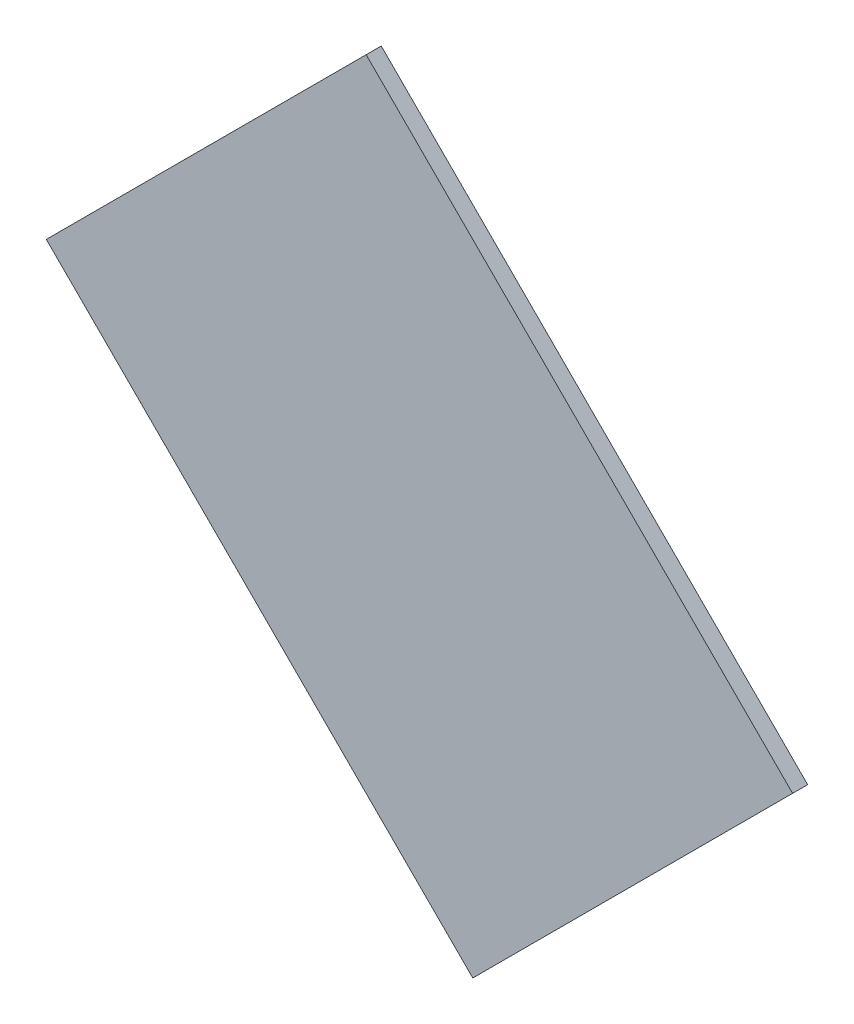
ISO-10303-21;
HEADER;
FILE_DESCRIPTION(('STEP AP214'),'2;1');
FILE_NAME('part.step','',(''),(''),'','','');
FILE_SCHEMA(('AUTOMOTIVE_DESIGN { 1 0 10303 214 1 1 1 1 }'));
ENDSEC;
DATA;
#1=APPLICATION_CONTEXT('core data for automotive mechanical design processes');
#2=APPLICATION_PROTOCOL_DEFINITION('international standard','automotive_design',2000,#1);
#3=PRODUCT_CONTEXT('',#1,'mechanical');
#4=PRODUCT('Part','Part','',(#3));
#5=PRODUCT_RELATED_PRODUCT_CATEGORY('part','',(#4));
#6=PRODUCT_DEFINITION_FORMATION('','',#4);
#7=PRODUCT_DEFINITION_CONTEXT('part definition',#1,'design');
#8=PRODUCT_DEFINITION('design','',#6,#7);
#9=PRODUCT_DEFINITION_SHAPE('','',#8);
#10=(LENGTH_UNIT() NAMED_UNIT(*) SI_UNIT(.MILLI.,.METRE.));
#11=(NAMED_UNIT(*) PLANE_ANGLE_UNIT() SI_UNIT($,.RADIAN.));
#12=(NAMED_UNIT(*) SI_UNIT($,.STERADIAN.) SOLID_ANGLE_UNIT());
#13=UNCERTAINTY_MEASURE_WITH_UNIT(LENGTH_MEASURE(1.E-05),#10,'distance_accuracy_value','');
#14=(GEOMETRIC_REPRESENTATION_CONTEXT(3) GLOBAL_UNCERTAINTY_ASSIGNED_CONTEXT((#13)) GLOBAL_UNIT_ASSIGNED_CONTEXT((#10,
#11,#12)) REPRESENTATION_CONTEXT('',''));
#15=CARTESIAN_POINT('',(0.,0.,0.));
#16=DIRECTION('',(0.,0.,1.));
#17=DIRECTION('',(1.,0.,0.));
#18=AXIS2_PLACEMENT_3D('',#15,#16,#17);
#19=CARTESIAN_POINT('',(0.,0.,4.2));
#20=DIRECTION('',(0.,0.,1.));
#21=DIRECTION('',(1.,0.,0.));
#22=AXIS2_PLACEMENT_3D('',#19,#20,#21);
#23=PLANE('',#22);
#24=DIRECTION('',(0.707106781186548,-0.707106781186548,0.));
#25=VECTOR('',#24,1.);
#26=CARTESIAN_POINT('',(-2.474873734153,0.353553390593,4.2));
#27=LINE('',#26,#25);
#28=CARTESIAN_POINT('',(-2.474873734153,0.353553390593,4.2));
#29=VERTEX_POINT('',#28);
#30=CARTESIAN_POINT('',(0.353553390593,-2.474873734153,4.2));
#31=VERTEX_POINT('',#30);
#32=EDGE_CURVE('E81',#29,#31,#27,.T.);
#33=ORIENTED_EDGE('',*,*,#32,.T.);
#34=DIRECTION('',(0.707106781186548,0.707106781186548,0.));
#35=VECTOR('',#34,1.);
#36=CARTESIAN_POINT('',(0.353553390593,-2.474873734153,4.2));
#37=LINE('',#36,#35);
#38=CARTESIAN_POINT('',(2.474873734153,-0.353553390593,4.2));
#39=VERTEX_POINT('',#38);
#40=EDGE_CURVE('E102',#31,#39,#37,.T.);
#41=ORIENTED_EDGE('',*,*,#40,.T.);
#42=DIRECTION('',(-0.707106781186548,0.707106781186548,0.));
#43=VECTOR('',#42,1.);
#44=CARTESIAN_POINT('',(2.474873734153,-0.353553390593,4.2));
#45=LINE('',#44,#43);
#46=CARTESIAN_POINT('',(-0.353553390593,2.474873734153,4.2));
#47=VERTEX_POINT('',#46);
#48=EDGE_CURVE('E72',#39,#47,#45,.T.);
#49=ORIENTED_EDGE('',*,*,#48,.T.);
#50=DIRECTION('',(-0.707106781186548,-0.707106781186548,0.));
#51=VECTOR('',#50,1.);
#52=CARTESIAN_POINT('',(-0.353553390593,2.474873734153,4.2));
#53=LINE('',#52,#51);
#54=EDGE_CURVE('E11',#47,#29,#53,.T.);
#55=ORIENTED_EDGE('',*,*,#54,.T.);
#56=EDGE_LOOP('',(#33,#41,#49,#55));
#57=FACE_BOUND('',#56,.T.);
#58=ADVANCED_FACE('F17',(#57),#23,.T.);
#59=CARTESIAN_POINT('',(0.,0.,4.1));
#60=DIRECTION('',(0.,0.,1.));
#61=DIRECTION('',(1.,0.,0.));
#62=AXIS2_PLACEMENT_3D('',#59,#60,#61);
#63=PLANE('',#62);
#64=DIRECTION('',(-0.707106781186548,-0.707106781186548,0.));
#65=VECTOR('',#64,1.);
#66=CARTESIAN_POINT('',(-0.353553390593,2.474873734153,4.1));
#67=LINE('',#66,#65);
#68=CARTESIAN_POINT('',(-0.353553390593,2.474873734153,4.1));
#69=VERTEX_POINT('',#68);
#70=CARTESIAN_POINT('',(-2.474873734153,0.353553390593,4.1));
#71=VERTEX_POINT('',#70);
#72=EDGE_CURVE('E25',#69,#71,#67,.T.);
#73=ORIENTED_EDGE('',*,*,#72,.F.);
#74=DIRECTION('',(-0.707106781186548,0.707106781186548,0.));
#75=VECTOR('',#74,1.);
#76=CARTESIAN_POINT('',(2.474873734153,-0.353553390593,4.1));
#77=LINE('',#76,#75);
#78=CARTESIAN_POINT('',(2.474873734153,-0.353553390593,4.1));
#79=VERTEX_POINT('',#78);
#80=EDGE_CURVE('E107',#79,#69,#77,.T.);
#81=ORIENTED_EDGE('',*,*,#80,.F.);
#82=DIRECTION('',(0.707106781186548,0.707106781186548,0.));
#83=VECTOR('',#82,1.);
#84=CARTESIAN_POINT('',(0.353553390593,-2.474873734153,4.1));
#85=LINE('',#84,#83);
#86=CARTESIAN_POINT('',(0.353553390593,-2.474873734153,4.1));
#87=VERTEX_POINT('',#86);
#88=EDGE_CURVE('E83',#87,#79,#85,.T.);
#89=ORIENTED_EDGE('',*,*,#88,.F.);
#90=DIRECTION('',(0.707106781186548,-0.707106781186548,0.));
#91=VECTOR('',#90,1.);
#92=CARTESIAN_POINT('',(-2.474873734153,0.353553390593,4.1));
#93=LINE('',#92,#91);
#94=EDGE_CURVE('E78',#71,#87,#93,.T.);
#95=ORIENTED_EDGE('',*,*,#94,.F.);
#96=EDGE_LOOP('',(#73,#81,#89,#95));
#97=FACE_BOUND('',#96,.T.);
#98=ADVANCED_FACE('F84',(#97),#63,.F.);
#99=CARTESIAN_POINT('',(-0.353553390593,2.474873734153,4.1));
#100=DIRECTION('',(0.707106781186548,-0.707106781186548,0.));
#101=DIRECTION('',(0.,0.,-1.));
#102=AXIS2_PLACEMENT_3D('',#99,#100,#101);
#103=PLANE('',#102);
#104=ORIENTED_EDGE('',*,*,#72,.T.);
#105=DIRECTION('',(0.,0.,1.));
#106=VECTOR('',#105,1.);
#107=CARTESIAN_POINT('',(-2.474873734153,0.353553390593,4.1));
#108=LINE('',#107,#106);
#109=EDGE_CURVE('E68',#71,#29,#108,.T.);
#110=ORIENTED_EDGE('',*,*,#109,.T.);
#111=ORIENTED_EDGE('',*,*,#54,.F.);
#112=DIRECTION('',(0.,0.,1.));
#113=VECTOR('',#112,1.);
#114=CARTESIAN_POINT('',(-0.353553390593,2.474873734153,4.1));
#115=LINE('',#114,#113);
#116=EDGE_CURVE('E75',#69,#47,#115,.T.);
#117=ORIENTED_EDGE('',*,*,#116,.F.);
#118=EDGE_LOOP('',(#104,#110,#111,#117));
#119=FACE_BOUND('',#118,.T.);
#120=ADVANCED_FACE('F70',(#119),#103,.F.);
#121=CARTESIAN_POINT('',(2.474873734153,-0.353553390593,4.1));
#122=DIRECTION('',(-0.707106781186548,-0.707106781186548,0.));
#123=DIRECTION('',(-0.707106781186548,0.707106781186548,0.));
#124=AXIS2_PLACEMENT_3D('',#121,#122,#123);
#125=PLANE('',#124);
#126=ORIENTED_EDGE('',*,*,#80,.T.);
#127=ORIENTED_EDGE('',*,*,#116,.T.);
#128=ORIENTED_EDGE('',*,*,#48,.F.);
#129=DIRECTION('',(0.,0.,1.));
#130=VECTOR('',#129,1.);
#131=CARTESIAN_POINT('',(2.474873734153,-0.353553390593,4.1));
#132=LINE('',#131,#130);
#133=EDGE_CURVE('E99',#79,#39,#132,.T.);
#134=ORIENTED_EDGE('',*,*,#133,.F.);
#135=EDGE_LOOP('',(#126,#127,#128,#134));
#136=FACE_BOUND('',#135,.T.);
#137=ADVANCED_FACE('F118',(#136),#125,.F.);
#138=CARTESIAN_POINT('',(0.353553390593,-2.474873734153,4.1));
#139=DIRECTION('',(-0.707106781186548,0.707106781186548,0.));
#140=DIRECTION('',(0.,0.,1.));
#141=AXIS2_PLACEMENT_3D('',#138,#139,#140);
#142=PLANE('',#141);
#143=ORIENTED_EDGE('',*,*,#88,.T.);
#144=ORIENTED_EDGE('',*,*,#133,.T.);
#145=ORIENTED_EDGE('',*,*,#40,.F.);
#146=DIRECTION('',(0.,0.,1.));
#147=VECTOR('',#146,1.);
#148=CARTESIAN_POINT('',(0.353553390593,-2.474873734153,4.1));
#149=LINE('',#148,#147);
#150=EDGE_CURVE('E90',#87,#31,#149,.T.);
#151=ORIENTED_EDGE('',*,*,#150,.F.);
#152=EDGE_LOOP('',(#143,#144,#145,#151));
#153=FACE_BOUND('',#152,.T.);
#154=ADVANCED_FACE('F121',(#153),#142,.F.);
#155=CARTESIAN_POINT('',(-2.474873734153,0.353553390593,4.1));
#156=DIRECTION('',(0.707106781186548,0.707106781186548,0.));
#157=DIRECTION('',(0.,0.,-1.));
#158=AXIS2_PLACEMENT_3D('',#155,#156,#157);
#159=PLANE('',#158);
#160=ORIENTED_EDGE('',*,*,#94,.T.);
#161=ORIENTED_EDGE('',*,*,#150,.T.);
#162=ORIENTED_EDGE('',*,*,#32,.F.);
#163=ORIENTED_EDGE('',*,*,#109,.F.);
#164=EDGE_LOOP('',(#160,#161,#162,#163));
#165=FACE_BOUND('',#164,.T.);
#166=ADVANCED_FACE('F80',(#165),#159,.F.);
#167=CLOSED_SHELL('',(#58,#98,#120,#137,#154,#166));
#168=MANIFOLD_SOLID_BREP('B1',#167);
#169=ADVANCED_BREP_SHAPE_REPRESENTATION('',(#18,#168),#14);
#170=SHAPE_DEFINITION_REPRESENTATION(#9,#169);
ENDSEC;
END-ISO-10303-21;
